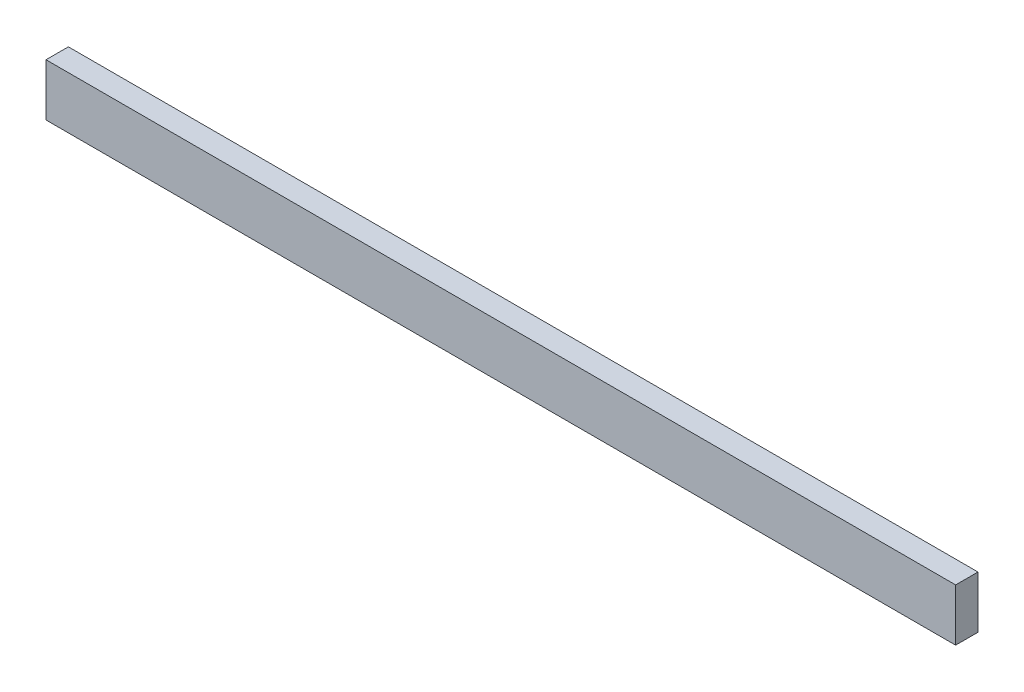
ISO-10303-21;
HEADER;
FILE_DESCRIPTION(('STEP AP214'),'2;1');
FILE_NAME('part.step','',(''),(''),'','','');
FILE_SCHEMA(('AUTOMOTIVE_DESIGN { 1 0 10303 214 1 1 1 1 }'));
ENDSEC;
DATA;
#1=APPLICATION_CONTEXT('core data for automotive mechanical design processes');
#2=APPLICATION_PROTOCOL_DEFINITION('international standard','automotive_design',2000,#1);
#3=PRODUCT_CONTEXT('',#1,'mechanical');
#4=PRODUCT('Part','Part','',(#3));
#5=PRODUCT_RELATED_PRODUCT_CATEGORY('part','',(#4));
#6=PRODUCT_DEFINITION_FORMATION('','',#4);
#7=PRODUCT_DEFINITION_CONTEXT('part definition',#1,'design');
#8=PRODUCT_DEFINITION('design','',#6,#7);
#9=PRODUCT_DEFINITION_SHAPE('','',#8);
#10=(LENGTH_UNIT() NAMED_UNIT(*) SI_UNIT(.MILLI.,.METRE.));
#11=(NAMED_UNIT(*) PLANE_ANGLE_UNIT() SI_UNIT($,.RADIAN.));
#12=(NAMED_UNIT(*) SI_UNIT($,.STERADIAN.) SOLID_ANGLE_UNIT());
#13=UNCERTAINTY_MEASURE_WITH_UNIT(LENGTH_MEASURE(1.E-05),#10,'distance_accuracy_value','');
#14=(GEOMETRIC_REPRESENTATION_CONTEXT(3) GLOBAL_UNCERTAINTY_ASSIGNED_CONTEXT((#13)) GLOBAL_UNIT_ASSIGNED_CONTEXT((#10,
#11,#12)) REPRESENTATION_CONTEXT('',''));
#15=CARTESIAN_POINT('',(0.,0.,0.));
#16=DIRECTION('',(0.,0.,1.));
#17=DIRECTION('',(1.,0.,0.));
#18=AXIS2_PLACEMENT_3D('',#15,#16,#17);
#19=CARTESIAN_POINT('',(0.,0.,19.05));
#20=DIRECTION('',(1.,0.,0.));
#21=DIRECTION('',(0.,0.,-1.));
#22=AXIS2_PLACEMENT_3D('',#19,#20,#21);
#23=PLANE('',#22);
#24=DIRECTION('',(0.,-1.,0.));
#25=VECTOR('',#24,1.);
#26=CARTESIAN_POINT('',(0.,0.,0.));
#27=LINE('',#26,#25);
#28=CARTESIAN_POINT('',(0.,44.45,0.));
#29=VERTEX_POINT('',#28);
#30=CARTESIAN_POINT('',(0.,0.,0.));
#31=VERTEX_POINT('',#30);
#32=EDGE_CURVE('E96',#29,#31,#27,.T.);
#33=ORIENTED_EDGE('',*,*,#32,.T.);
#34=DIRECTION('',(0.,0.,-1.));
#35=VECTOR('',#34,1.);
#36=CARTESIAN_POINT('',(0.,0.,19.05));
#37=LINE('',#36,#35);
#38=CARTESIAN_POINT('',(0.,0.,19.05));
#39=VERTEX_POINT('',#38);
#40=EDGE_CURVE('E11',#39,#31,#37,.T.);
#41=ORIENTED_EDGE('',*,*,#40,.F.);
#42=DIRECTION('',(0.,-1.,0.));
#43=VECTOR('',#42,1.);
#44=CARTESIAN_POINT('',(0.,0.,19.05));
#45=LINE('',#44,#43);
#46=CARTESIAN_POINT('',(0.,44.45,19.05));
#47=VERTEX_POINT('',#46);
#48=EDGE_CURVE('E84',#47,#39,#45,.T.);
#49=ORIENTED_EDGE('',*,*,#48,.F.);
#50=DIRECTION('',(0.,0.,-1.));
#51=VECTOR('',#50,1.);
#52=CARTESIAN_POINT('',(0.,44.45,19.05));
#53=LINE('',#52,#51);
#54=EDGE_CURVE('E92',#47,#29,#53,.T.);
#55=ORIENTED_EDGE('',*,*,#54,.T.);
#56=EDGE_LOOP('',(#33,#41,#49,#55));
#57=FACE_BOUND('',#56,.T.);
#58=ADVANCED_FACE('F33',(#57),#23,.F.);
#59=CARTESIAN_POINT('',(0.,0.,19.05));
#60=DIRECTION('',(0.,1.,0.));
#61=DIRECTION('',(0.,0.,1.));
#62=AXIS2_PLACEMENT_3D('',#59,#60,#61);
#63=PLANE('',#62);
#64=DIRECTION('',(1.,0.,0.));
#65=VECTOR('',#64,1.);
#66=CARTESIAN_POINT('',(0.,0.,0.));
#67=LINE('',#66,#65);
#68=CARTESIAN_POINT('',(774.7,0.,0.));
#69=VERTEX_POINT('',#68);
#70=EDGE_CURVE('E88',#31,#69,#67,.T.);
#71=ORIENTED_EDGE('',*,*,#70,.T.);
#72=DIRECTION('',(0.,0.,-1.));
#73=VECTOR('',#72,1.);
#74=CARTESIAN_POINT('',(774.7,0.,19.05));
#75=LINE('',#74,#73);
#76=CARTESIAN_POINT('',(774.7,0.,19.05));
#77=VERTEX_POINT('',#76);
#78=EDGE_CURVE('E41',#77,#69,#75,.T.);
#79=ORIENTED_EDGE('',*,*,#78,.F.);
#80=DIRECTION('',(1.,0.,0.));
#81=VECTOR('',#80,1.);
#82=CARTESIAN_POINT('',(0.,0.,19.05));
#83=LINE('',#82,#81);
#84=EDGE_CURVE('E79',#39,#77,#83,.T.);
#85=ORIENTED_EDGE('',*,*,#84,.F.);
#86=ORIENTED_EDGE('',*,*,#40,.T.);
#87=EDGE_LOOP('',(#71,#79,#85,#86));
#88=FACE_BOUND('',#87,.T.);
#89=ADVANCED_FACE('F87',(#88),#63,.F.);
#90=CARTESIAN_POINT('',(774.7,0.,19.05));
#91=DIRECTION('',(-1.,0.,0.));
#92=DIRECTION('',(0.,0.,1.));
#93=AXIS2_PLACEMENT_3D('',#90,#91,#92);
#94=PLANE('',#93);
#95=DIRECTION('',(0.,1.,0.));
#96=VECTOR('',#95,1.);
#97=CARTESIAN_POINT('',(774.7,0.,0.));
#98=LINE('',#97,#96);
#99=CARTESIAN_POINT('',(774.7,44.45,0.));
#100=VERTEX_POINT('',#99);
#101=EDGE_CURVE('E66',#69,#100,#98,.T.);
#102=ORIENTED_EDGE('',*,*,#101,.T.);
#103=DIRECTION('',(0.,0.,-1.));
#104=VECTOR('',#103,1.);
#105=CARTESIAN_POINT('',(774.7,44.45,19.05));
#106=LINE('',#105,#104);
#107=CARTESIAN_POINT('',(774.7,44.45,19.05));
#108=VERTEX_POINT('',#107);
#109=EDGE_CURVE('E89',#108,#100,#106,.T.);
#110=ORIENTED_EDGE('',*,*,#109,.F.);
#111=DIRECTION('',(0.,1.,0.));
#112=VECTOR('',#111,1.);
#113=CARTESIAN_POINT('',(774.7,0.,19.05));
#114=LINE('',#113,#112);
#115=EDGE_CURVE('E82',#77,#108,#114,.T.);
#116=ORIENTED_EDGE('',*,*,#115,.F.);
#117=ORIENTED_EDGE('',*,*,#78,.T.);
#118=EDGE_LOOP('',(#102,#110,#116,#117));
#119=FACE_BOUND('',#118,.T.);
#120=ADVANCED_FACE('F90',(#119),#94,.F.);
#121=CARTESIAN_POINT('',(0.,44.45,19.05));
#122=DIRECTION('',(0.,-1.,0.));
#123=DIRECTION('',(0.,0.,-1.));
#124=AXIS2_PLACEMENT_3D('',#121,#122,#123);
#125=PLANE('',#124);
#126=DIRECTION('',(-1.,0.,0.));
#127=VECTOR('',#126,1.);
#128=CARTESIAN_POINT('',(0.,44.45,0.));
#129=LINE('',#128,#127);
#130=EDGE_CURVE('E72',#100,#29,#129,.T.);
#131=ORIENTED_EDGE('',*,*,#130,.T.);
#132=ORIENTED_EDGE('',*,*,#54,.F.);
#133=DIRECTION('',(-1.,0.,0.));
#134=VECTOR('',#133,1.);
#135=CARTESIAN_POINT('',(0.,44.45,19.05));
#136=LINE('',#135,#134);
#137=EDGE_CURVE('E49',#108,#47,#136,.T.);
#138=ORIENTED_EDGE('',*,*,#137,.F.);
#139=ORIENTED_EDGE('',*,*,#109,.T.);
#140=EDGE_LOOP('',(#131,#132,#138,#139));
#141=FACE_BOUND('',#140,.T.);
#142=ADVANCED_FACE('F103',(#141),#125,.F.);
#143=CARTESIAN_POINT('',(0.,0.,19.05));
#144=DIRECTION('',(0.,0.,-1.));
#145=DIRECTION('',(-1.,0.,0.));
#146=AXIS2_PLACEMENT_3D('',#143,#144,#145);
#147=PLANE('',#146);
#148=ORIENTED_EDGE('',*,*,#48,.T.);
#149=ORIENTED_EDGE('',*,*,#84,.T.);
#150=ORIENTED_EDGE('',*,*,#115,.T.);
#151=ORIENTED_EDGE('',*,*,#137,.T.);
#152=EDGE_LOOP('',(#148,#149,#150,#151));
#153=FACE_BOUND('',#152,.T.);
#154=ADVANCED_FACE('F80',(#153),#147,.F.);
#155=CARTESIAN_POINT('',(0.,0.,0.));
#156=DIRECTION('',(0.,0.,-1.));
#157=DIRECTION('',(-1.,0.,0.));
#158=AXIS2_PLACEMENT_3D('',#155,#156,#157);
#159=PLANE('',#158);
#160=ORIENTED_EDGE('',*,*,#32,.F.);
#161=ORIENTED_EDGE('',*,*,#130,.F.);
#162=ORIENTED_EDGE('',*,*,#101,.F.);
#163=ORIENTED_EDGE('',*,*,#70,.F.);
#164=EDGE_LOOP('',(#160,#161,#162,#163));
#165=FACE_BOUND('',#164,.T.);
#166=ADVANCED_FACE('F106',(#165),#159,.T.);
#167=CLOSED_SHELL('',(#58,#89,#120,#142,#154,#166));
#168=MANIFOLD_SOLID_BREP('B2',#167);
#169=ADVANCED_BREP_SHAPE_REPRESENTATION('',(#18,#168),#14);
#170=SHAPE_DEFINITION_REPRESENTATION(#9,#169);
ENDSEC;
END-ISO-10303-21;
